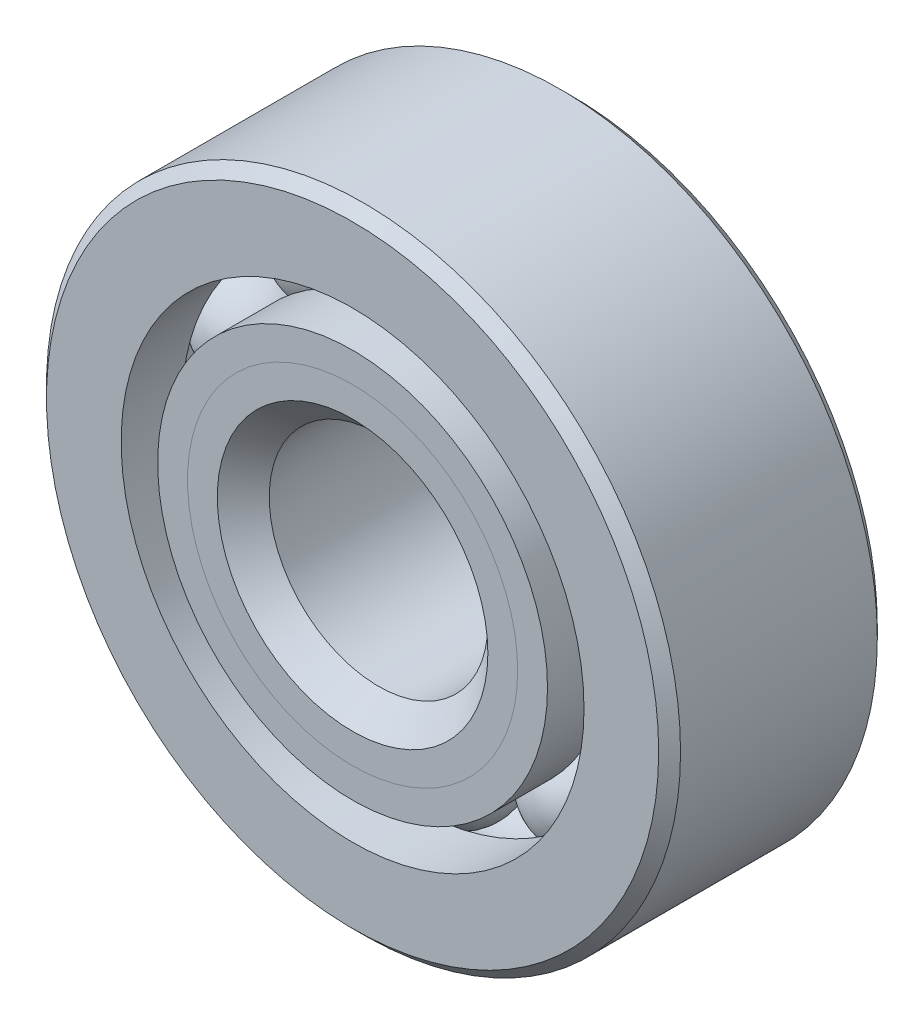
ISO-10303-21;
HEADER;
FILE_DESCRIPTION(('STEP AP214'),'2;1');
FILE_NAME('part.step','',(''),(''),'','','');
FILE_SCHEMA(('AUTOMOTIVE_DESIGN { 1 0 10303 214 1 1 1 1 }'));
ENDSEC;
DATA;
#1=APPLICATION_CONTEXT('core data for automotive mechanical design processes');
#2=APPLICATION_PROTOCOL_DEFINITION('international standard','automotive_design',2000,#1);
#3=PRODUCT_CONTEXT('',#1,'mechanical');
#4=PRODUCT('Part','Part','',(#3));
#5=PRODUCT_RELATED_PRODUCT_CATEGORY('part','',(#4));
#6=PRODUCT_DEFINITION_FORMATION('','',#4);
#7=PRODUCT_DEFINITION_CONTEXT('part definition',#1,'design');
#8=PRODUCT_DEFINITION('design','',#6,#7);
#9=PRODUCT_DEFINITION_SHAPE('','',#8);
#10=(LENGTH_UNIT() NAMED_UNIT(*) SI_UNIT(.MILLI.,.METRE.));
#11=(NAMED_UNIT(*) PLANE_ANGLE_UNIT() SI_UNIT($,.RADIAN.));
#12=(NAMED_UNIT(*) SI_UNIT($,.STERADIAN.) SOLID_ANGLE_UNIT());
#13=UNCERTAINTY_MEASURE_WITH_UNIT(LENGTH_MEASURE(1.E-05),#10,'distance_accuracy_value','');
#14=(GEOMETRIC_REPRESENTATION_CONTEXT(3) GLOBAL_UNCERTAINTY_ASSIGNED_CONTEXT((#13)) GLOBAL_UNIT_ASSIGNED_CONTEXT((#10,
#11,#12)) REPRESENTATION_CONTEXT('',''));
#15=CARTESIAN_POINT('',(0.,0.,0.));
#16=DIRECTION('',(0.,0.,1.));
#17=DIRECTION('',(1.,0.,0.));
#18=AXIS2_PLACEMENT_3D('',#15,#16,#17);
#19=CARTESIAN_POINT('',(-4.54890680406964,6.26103308302993,0.));
#20=DIRECTION('',(0.,0.,1.));
#21=DIRECTION('',(-0.587785252292462,0.809016994374955,0.));
#22=AXIS2_PLACEMENT_3D('',#19,#20,#21);
#23=SPHERICAL_SURFACE('',#22,1.88434509807669);
#24=CARTESIAN_POINT('',(-4.54890680406964,6.26103308302993,1.88434509807669));
#25=VERTEX_POINT('',#24);
#26=VERTEX_LOOP('',#25);
#27=FACE_BOUND('',#26,.T.);
#28=ADVANCED_FACE('F52',(#27),#23,.T.);
#29=CLOSED_SHELL('',(#28));
#30=MANIFOLD_SOLID_BREP('B2',#29);
#31=CARTESIAN_POINT('',(-7.36028582064043,2.39150183302995,0.));
#32=DIRECTION('',(0.,0.,1.));
#33=DIRECTION('',(-0.95105651629515,0.309016994374958,0.));
#34=AXIS2_PLACEMENT_3D('',#31,#32,#33);
#35=SPHERICAL_SURFACE('',#34,1.88434509807669);
#36=CARTESIAN_POINT('',(-7.36028582064043,2.39150183302995,1.88434509807669));
#37=VERTEX_POINT('',#36);
#38=VERTEX_LOOP('',#37);
#39=FACE_BOUND('',#38,.T.);
#40=ADVANCED_FACE('F94',(#39),#35,.T.);
#41=CLOSED_SHELL('',(#40));
#42=MANIFOLD_SOLID_BREP('B6',#41);
#43=CARTESIAN_POINT('',(-7.36028582064049,-2.3915018330298,0.));
#44=DIRECTION('',(0.,0.,1.));
#45=DIRECTION('',(-0.951056516295157,-0.309016994374938,0.));
#46=AXIS2_PLACEMENT_3D('',#43,#44,#45);
#47=SPHERICAL_SURFACE('',#46,1.88434509807669);
#48=CARTESIAN_POINT('',(-7.36028582064049,-2.3915018330298,1.88434509807669));
#49=VERTEX_POINT('',#48);
#50=VERTEX_LOOP('',#49);
#51=FACE_BOUND('',#50,.T.);
#52=ADVANCED_FACE('F136',(#51),#47,.T.);
#53=CLOSED_SHELL('',(#52));
#54=MANIFOLD_SOLID_BREP('B48',#53);
#55=CARTESIAN_POINT('',(-4.54890680406977,-6.26103308302983,0.));
#56=DIRECTION('',(0.,0.,1.));
#57=DIRECTION('',(-0.58778525229248,-0.809016994374942,0.));
#58=AXIS2_PLACEMENT_3D('',#55,#56,#57);
#59=SPHERICAL_SURFACE('',#58,1.88434509807669);
#60=CARTESIAN_POINT('',(-4.54890680406977,-6.26103308302983,1.88434509807669));
#61=VERTEX_POINT('',#60);
#62=VERTEX_LOOP('',#61);
#63=FACE_BOUND('',#62,.T.);
#64=ADVANCED_FACE('F176',(#63),#59,.T.);
#65=CLOSED_SHELL('',(#64));
#66=MANIFOLD_SOLID_BREP('B90',#65);
#67=CARTESIAN_POINT('',(0.,-7.7390625,0.));
#68=DIRECTION('',(0.,0.,1.));
#69=DIRECTION('',(0.,-1.,0.));
#70=AXIS2_PLACEMENT_3D('',#67,#68,#69);
#71=SPHERICAL_SURFACE('',#70,1.88434509807669);
#72=CARTESIAN_POINT('',(0.,-7.7390625,1.88434509807669));
#73=VERTEX_POINT('',#72);
#74=VERTEX_LOOP('',#73);
#75=FACE_BOUND('',#74,.T.);
#76=ADVANCED_FACE('F218',(#75),#71,.T.);
#77=CLOSED_SHELL('',(#76));
#78=MANIFOLD_SOLID_BREP('B132',#77);
#79=CARTESIAN_POINT('',(4.54890680406968,-6.26103308302989,0.));
#80=DIRECTION('',(0.,0.,1.));
#81=DIRECTION('',(0.587785252292469,-0.809016994374951,0.));
#82=AXIS2_PLACEMENT_3D('',#79,#80,#81);
#83=SPHERICAL_SURFACE('',#82,1.88434509807669);
#84=CARTESIAN_POINT('',(4.54890680406968,-6.26103308302989,1.88434509807669));
#85=VERTEX_POINT('',#84);
#86=VERTEX_LOOP('',#85);
#87=FACE_BOUND('',#86,.T.);
#88=ADVANCED_FACE('F260',(#87),#83,.T.);
#89=CLOSED_SHELL('',(#88));
#90=MANIFOLD_SOLID_BREP('B172',#89);
#91=CARTESIAN_POINT('',(7.36028582064045,-2.3915018330299,0.));
#92=DIRECTION('',(0.,0.,1.));
#93=DIRECTION('',(0.951056516295152,-0.309016994374952,0.));
#94=AXIS2_PLACEMENT_3D('',#91,#92,#93);
#95=SPHERICAL_SURFACE('',#94,1.88434509807669);
#96=CARTESIAN_POINT('',(7.36028582064045,-2.3915018330299,1.88434509807669));
#97=VERTEX_POINT('',#96);
#98=VERTEX_LOOP('',#97);
#99=FACE_BOUND('',#98,.T.);
#100=ADVANCED_FACE('F302',(#99),#95,.T.);
#101=CLOSED_SHELL('',(#100));
#102=MANIFOLD_SOLID_BREP('B214',#101);
#103=CARTESIAN_POINT('',(7.36028582064047,2.39150183302985,0.));
#104=DIRECTION('',(0.,0.,1.));
#105=DIRECTION('',(0.951056516295155,0.309016994374945,0.));
#106=AXIS2_PLACEMENT_3D('',#103,#104,#105);
#107=SPHERICAL_SURFACE('',#106,1.88434509807669);
#108=CARTESIAN_POINT('',(7.36028582064047,2.39150183302985,1.88434509807669));
#109=VERTEX_POINT('',#108);
#110=VERTEX_LOOP('',#109);
#111=FACE_BOUND('',#110,.T.);
#112=ADVANCED_FACE('F342',(#111),#107,.T.);
#113=CLOSED_SHELL('',(#112));
#114=MANIFOLD_SOLID_BREP('B256',#113);
#115=CARTESIAN_POINT('',(4.54890680406973,6.26103308302986,0.));
#116=DIRECTION('',(0.,0.,1.));
#117=DIRECTION('',(0.587785252292474,0.809016994374947,0.));
#118=AXIS2_PLACEMENT_3D('',#115,#116,#117);
#119=SPHERICAL_SURFACE('',#118,1.88434509807669);
#120=CARTESIAN_POINT('',(4.54890680406973,6.26103308302986,1.88434509807669));
#121=VERTEX_POINT('',#120);
#122=VERTEX_LOOP('',#121);
#123=FACE_BOUND('',#122,.T.);
#124=ADVANCED_FACE('F384',(#123),#119,.T.);
#125=CLOSED_SHELL('',(#124));
#126=MANIFOLD_SOLID_BREP('B298',#125);
#127=CARTESIAN_POINT('',(0.,7.7390625,0.));
#128=DIRECTION('',(0.,0.,1.));
#129=DIRECTION('',(0.,1.,0.));
#130=AXIS2_PLACEMENT_3D('',#127,#128,#129);
#131=SPHERICAL_SURFACE('',#130,1.88434509807669);
#132=CARTESIAN_POINT('',(0.,7.7390625,1.88434509807669));
#133=VERTEX_POINT('',#132);
#134=VERTEX_LOOP('',#133);
#135=FACE_BOUND('',#134,.T.);
#136=ADVANCED_FACE('F428',(#135),#131,.T.);
#137=CLOSED_SHELL('',(#136));
#138=MANIFOLD_SOLID_BREP('B338',#137);
#139=CARTESIAN_POINT('',(0.,5.99394205652479,3.96875));
#140=DIRECTION('',(0.,0.,-1.));
#141=DIRECTION('',(-1.,0.,0.));
#142=AXIS2_PLACEMENT_3D('',#139,#140,#141);
#143=PLANE('',#142);
#144=CARTESIAN_POINT('',(0.,0.,3.96875));
#145=DIRECTION('',(0.,0.,1.));
#146=DIRECTION('',(1.,0.,0.));
#147=AXIS2_PLACEMENT_3D('',#144,#145,#146);
#148=CIRCLE('',#147,4.91173370096166);
#149=CARTESIAN_POINT('',(4.91173370096166,0.,3.96875));
#150=VERTEX_POINT('',#149);
#151=EDGE_CURVE('E488',#150,#150,#148,.T.);
#152=ORIENTED_EDGE('',*,*,#151,.F.);
#153=EDGE_LOOP('',(#152));
#154=FACE_BOUND('',#153,.T.);
#155=CARTESIAN_POINT('',(0.,0.,3.96875));
#156=DIRECTION('',(0.,0.,1.));
#157=DIRECTION('',(1.,0.,0.));
#158=AXIS2_PLACEMENT_3D('',#155,#156,#157);
#159=CIRCLE('',#158,5.99394205652479);
#160=CARTESIAN_POINT('',(5.99394205652479,0.,3.96875));
#161=VERTEX_POINT('',#160);
#162=EDGE_CURVE('E427',#161,#161,#159,.T.);
#163=ORIENTED_EDGE('',*,*,#162,.T.);
#164=EDGE_LOOP('',(#163));
#165=FACE_BOUND('',#164,.T.);
#166=ADVANCED_FACE('F447',(#154,#165),#143,.F.);
#167=CARTESIAN_POINT('',(0.,0.,2.88654164443688));
#168=DIRECTION('',(0.,0.,1.));
#169=DIRECTION('',(1.,0.,0.));
#170=AXIS2_PLACEMENT_3D('',#167,#168,#169);
#171=CONICAL_SURFACE('',#170,4.91173370096166,0.78539816339745);
#172=ORIENTED_EDGE('',*,*,#162,.F.);
#173=EDGE_LOOP('',(#172));
#174=FACE_BOUND('',#173,.T.);
#175=CARTESIAN_POINT('',(0.,0.,2.88654164443688));
#176=DIRECTION('',(0.,0.,1.));
#177=DIRECTION('',(1.,0.,0.));
#178=AXIS2_PLACEMENT_3D('',#175,#176,#177);
#179=CIRCLE('',#178,4.91173370096166);
#180=CARTESIAN_POINT('',(4.91173370096166,0.,2.88654164443688));
#181=VERTEX_POINT('',#180);
#182=EDGE_CURVE('E454',#181,#181,#179,.T.);
#183=ORIENTED_EDGE('',*,*,#182,.T.);
#184=EDGE_LOOP('',(#183));
#185=FACE_BOUND('',#184,.T.);
#186=ADVANCED_FACE('F495',(#174,#185),#171,.T.);
#187=CARTESIAN_POINT('',(0.,0.,3.96875));
#188=DIRECTION('',(0.,0.,1.));
#189=DIRECTION('',(1.,0.,0.));
#190=AXIS2_PLACEMENT_3D('',#187,#188,#189);
#191=CYLINDRICAL_SURFACE('',#190,4.91173370096166);
#192=ORIENTED_EDGE('',*,*,#182,.F.);
#193=EDGE_LOOP('',(#192));
#194=FACE_BOUND('',#193,.T.);
#195=CARTESIAN_POINT('',(0.,0.,0.));
#196=DIRECTION('',(0.,0.,1.));
#197=DIRECTION('',(1.,0.,0.));
#198=AXIS2_PLACEMENT_3D('',#195,#196,#197);
#199=CIRCLE('',#198,4.91173370096166);
#200=CARTESIAN_POINT('',(4.91173370096166,0.,0.));
#201=VERTEX_POINT('',#200);
#202=EDGE_CURVE('E460',#201,#201,#199,.T.);
#203=ORIENTED_EDGE('',*,*,#202,.T.);
#204=EDGE_LOOP('',(#203));
#205=FACE_BOUND('',#204,.T.);
#206=ADVANCED_FACE('F499',(#194,#205),#191,.T.);
#207=CARTESIAN_POINT('',(0.,4.91173370096166,0.));
#208=DIRECTION('',(0.,0.,-1.));
#209=DIRECTION('',(-1.,0.,0.));
#210=AXIS2_PLACEMENT_3D('',#207,#208,#209);
#211=PLANE('',#210);
#212=ORIENTED_EDGE('',*,*,#202,.F.);
#213=EDGE_LOOP('',(#212));
#214=FACE_BOUND('',#213,.T.);
#215=CARTESIAN_POINT('',(0.,0.,0.));
#216=DIRECTION('',(0.,0.,1.));
#217=DIRECTION('',(1.,0.,0.));
#218=AXIS2_PLACEMENT_3D('',#215,#216,#217);
#219=CIRCLE('',#218,5.85471740192331);
#220=CARTESIAN_POINT('',(5.85471740192331,0.,0.));
#221=VERTEX_POINT('',#220);
#222=EDGE_CURVE('E466',#221,#221,#219,.T.);
#223=ORIENTED_EDGE('',*,*,#222,.T.);
#224=EDGE_LOOP('',(#223));
#225=FACE_BOUND('',#224,.T.);
#226=ADVANCED_FACE('F504',(#214,#225),#211,.F.);
#227=CARTESIAN_POINT('',(0.,0.,0.));
#228=DIRECTION('',(0.,0.,1.));
#229=DIRECTION('',(1.,0.,0.));
#230=AXIS2_PLACEMENT_3D('',#227,#228,#229);
#231=TOROIDAL_SURFACE('',#230,7.7390625,1.88434509807669);
#232=ORIENTED_EDGE('',*,*,#222,.F.);
#233=EDGE_LOOP('',(#232));
#234=FACE_BOUND('',#233,.T.);
#235=CARTESIAN_POINT('',(0.,0.,-1.76388888888889));
#236=DIRECTION('',(0.,0.,1.));
#237=DIRECTION('',(1.,0.,0.));
#238=AXIS2_PLACEMENT_3D('',#235,#236,#237);
#239=CIRCLE('',#238,7.07615041208792);
#240=CARTESIAN_POINT('',(7.07615041208792,0.,-1.76388888888889));
#241=VERTEX_POINT('',#240);
#242=EDGE_CURVE('E471',#241,#241,#239,.T.);
#243=ORIENTED_EDGE('',*,*,#242,.T.);
#244=EDGE_LOOP('',(#243));
#245=FACE_BOUND('',#244,.T.);
#246=ADVANCED_FACE('F510',(#234,#245),#231,.F.);
#247=CARTESIAN_POINT('',(0.,0.,3.96875));
#248=DIRECTION('',(0.,0.,1.));
#249=DIRECTION('',(1.,0.,0.));
#250=AXIS2_PLACEMENT_3D('',#247,#248,#249);
#251=CYLINDRICAL_SURFACE('',#250,7.07615041208792);
#252=ORIENTED_EDGE('',*,*,#242,.F.);
#253=EDGE_LOOP('',(#252));
#254=FACE_BOUND('',#253,.T.);
#255=CARTESIAN_POINT('',(0.,0.,-3.96875));
#256=DIRECTION('',(0.,0.,1.));
#257=DIRECTION('',(1.,0.,0.));
#258=AXIS2_PLACEMENT_3D('',#255,#256,#257);
#259=CIRCLE('',#258,7.07615041208791);
#260=CARTESIAN_POINT('',(7.07615041208791,0.,-3.96875));
#261=VERTEX_POINT('',#260);
#262=EDGE_CURVE('E474',#261,#261,#259,.T.);
#263=ORIENTED_EDGE('',*,*,#262,.T.);
#264=EDGE_LOOP('',(#263));
#265=FACE_BOUND('',#264,.T.);
#266=ADVANCED_FACE('F514',(#254,#265),#251,.T.);
#267=CARTESIAN_POINT('',(0.,4.365625,-3.96875));
#268=DIRECTION('',(0.,0.,1.));
#269=DIRECTION('',(1.,0.,0.));
#270=AXIS2_PLACEMENT_3D('',#267,#268,#269);
#271=PLANE('',#270);
#272=ORIENTED_EDGE('',*,*,#262,.F.);
#273=EDGE_LOOP('',(#272));
#274=FACE_BOUND('',#273,.T.);
#275=CARTESIAN_POINT('',(0.,0.,-3.96875));
#276=DIRECTION('',(0.,0.,1.));
#277=DIRECTION('',(1.,0.,0.));
#278=AXIS2_PLACEMENT_3D('',#275,#276,#277);
#279=CIRCLE('',#278,4.365625);
#280=CARTESIAN_POINT('',(4.365625,0.,-3.96875));
#281=VERTEX_POINT('',#280);
#282=EDGE_CURVE('E477',#281,#281,#279,.T.);
#283=ORIENTED_EDGE('',*,*,#282,.T.);
#284=EDGE_LOOP('',(#283));
#285=FACE_BOUND('',#284,.T.);
#286=ADVANCED_FACE('F518',(#274,#285),#271,.F.);
#287=CARTESIAN_POINT('',(0.,0.,-3.571875));
#288=DIRECTION('',(0.,0.,-1.));
#289=DIRECTION('',(-1.,0.,0.));
#290=AXIS2_PLACEMENT_3D('',#287,#288,#289);
#291=CONICAL_SURFACE('',#290,3.96875,0.785398163397445);
#292=ORIENTED_EDGE('',*,*,#282,.F.);
#293=EDGE_LOOP('',(#292));
#294=FACE_BOUND('',#293,.T.);
#295=CARTESIAN_POINT('',(0.,0.,-3.571875));
#296=DIRECTION('',(0.,0.,1.));
#297=DIRECTION('',(1.,0.,0.));
#298=AXIS2_PLACEMENT_3D('',#295,#296,#297);
#299=CIRCLE('',#298,3.96875);
#300=CARTESIAN_POINT('',(3.96875,0.,-3.571875));
#301=VERTEX_POINT('',#300);
#302=EDGE_CURVE('E481',#301,#301,#299,.T.);
#303=ORIENTED_EDGE('',*,*,#302,.T.);
#304=EDGE_LOOP('',(#303));
#305=FACE_BOUND('',#304,.T.);
#306=ADVANCED_FACE('F522',(#294,#305),#291,.F.);
#307=CARTESIAN_POINT('',(0.,0.,3.96875));
#308=DIRECTION('',(0.,0.,1.));
#309=DIRECTION('',(1.,0.,0.));
#310=AXIS2_PLACEMENT_3D('',#307,#308,#309);
#311=CYLINDRICAL_SURFACE('',#310,3.96875);
#312=ORIENTED_EDGE('',*,*,#302,.F.);
#313=EDGE_LOOP('',(#312));
#314=FACE_BOUND('',#313,.T.);
#315=CARTESIAN_POINT('',(0.,0.,3.02576629903835));
#316=DIRECTION('',(0.,0.,1.));
#317=DIRECTION('',(1.,0.,0.));
#318=AXIS2_PLACEMENT_3D('',#315,#316,#317);
#319=CIRCLE('',#318,3.96875);
#320=CARTESIAN_POINT('',(3.96875,0.,3.02576629903835));
#321=VERTEX_POINT('',#320);
#322=EDGE_CURVE('E485',#321,#321,#319,.T.);
#323=ORIENTED_EDGE('',*,*,#322,.T.);
#324=EDGE_LOOP('',(#323));
#325=FACE_BOUND('',#324,.T.);
#326=ADVANCED_FACE('F526',(#314,#325),#311,.F.);
#327=CARTESIAN_POINT('',(0.,0.,3.96875));
#328=DIRECTION('',(0.,0.,1.));
#329=DIRECTION('',(1.,0.,0.));
#330=AXIS2_PLACEMENT_3D('',#327,#328,#329);
#331=CONICAL_SURFACE('',#330,4.91173370096166,0.78539816339745);
#332=ORIENTED_EDGE('',*,*,#322,.F.);
#333=EDGE_LOOP('',(#332));
#334=FACE_BOUND('',#333,.T.);
#335=ORIENTED_EDGE('',*,*,#151,.T.);
#336=EDGE_LOOP('',(#335));
#337=FACE_BOUND('',#336,.T.);
#338=ADVANCED_FACE('F492',(#334,#337),#331,.F.);
#339=CLOSED_SHELL('',(#166,#186,#206,#226,#246,#266,#286,#306,#326,#338));
#340=MANIFOLD_SOLID_BREP('B380',#339);
#341=CARTESIAN_POINT('',(0.,7.07615041208792,3.96875));
#342=DIRECTION('',(0.,0.,-1.));
#343=DIRECTION('',(-1.,0.,0.));
#344=AXIS2_PLACEMENT_3D('',#341,#342,#343);
#345=PLANE('',#344);
#346=CARTESIAN_POINT('',(0.,0.,3.96875));
#347=DIRECTION('',(0.,0.,1.));
#348=DIRECTION('',(1.,0.,0.));
#349=AXIS2_PLACEMENT_3D('',#346,#347,#348);
#350=CIRCLE('',#349,5.99394205652479);
#351=CARTESIAN_POINT('',(5.99394205652479,0.,3.96875));
#352=VERTEX_POINT('',#351);
#353=EDGE_CURVE('E446',#352,#352,#350,.T.);
#354=ORIENTED_EDGE('',*,*,#353,.F.);
#355=EDGE_LOOP('',(#354));
#356=FACE_BOUND('',#355,.T.);
#357=CARTESIAN_POINT('',(0.,0.,3.96875));
#358=DIRECTION('',(0.,0.,1.));
#359=DIRECTION('',(1.,0.,0.));
#360=AXIS2_PLACEMENT_3D('',#357,#358,#359);
#361=CIRCLE('',#360,7.07615041208792);
#362=CARTESIAN_POINT('',(7.07615041208792,0.,3.96875));
#363=VERTEX_POINT('',#362);
#364=EDGE_CURVE('E618',#363,#363,#361,.T.);
#365=ORIENTED_EDGE('',*,*,#364,.T.);
#366=EDGE_LOOP('',(#365));
#367=FACE_BOUND('',#366,.T.);
#368=ADVANCED_FACE('F593',(#356,#367),#345,.F.);
#369=CARTESIAN_POINT('',(0.,0.,3.96875));
#370=DIRECTION('',(0.,0.,1.));
#371=DIRECTION('',(1.,0.,0.));
#372=AXIS2_PLACEMENT_3D('',#369,#370,#371);
#373=CONICAL_SURFACE('',#372,5.99394205652479,0.78539816339745);
#374=CARTESIAN_POINT('',(0.,0.,2.88654164443688));
#375=DIRECTION('',(0.,0.,1.));
#376=DIRECTION('',(1.,0.,0.));
#377=AXIS2_PLACEMENT_3D('',#374,#375,#376);
#378=CIRCLE('',#377,4.91173370096166);
#379=CARTESIAN_POINT('',(4.91173370096166,0.,2.88654164443688));
#380=VERTEX_POINT('',#379);
#381=EDGE_CURVE('E600',#380,#380,#378,.T.);
#382=ORIENTED_EDGE('',*,*,#381,.F.);
#383=EDGE_LOOP('',(#382));
#384=FACE_BOUND('',#383,.T.);
#385=ORIENTED_EDGE('',*,*,#353,.T.);
#386=EDGE_LOOP('',(#385));
#387=FACE_BOUND('',#386,.T.);
#388=ADVANCED_FACE('F643',(#384,#387),#373,.F.);
#389=CARTESIAN_POINT('',(0.,0.,3.96875));
#390=DIRECTION('',(0.,0.,1.));
#391=DIRECTION('',(1.,0.,0.));
#392=AXIS2_PLACEMENT_3D('',#389,#390,#391);
#393=CYLINDRICAL_SURFACE('',#392,4.91173370096166);
#394=CARTESIAN_POINT('',(0.,0.,0.));
#395=DIRECTION('',(0.,0.,1.));
#396=DIRECTION('',(1.,0.,0.));
#397=AXIS2_PLACEMENT_3D('',#394,#395,#396);
#398=CIRCLE('',#397,4.91173370096166);
#399=CARTESIAN_POINT('',(4.91173370096166,0.,0.));
#400=VERTEX_POINT('',#399);
#401=EDGE_CURVE('E605',#400,#400,#398,.T.);
#402=ORIENTED_EDGE('',*,*,#401,.F.);
#403=EDGE_LOOP('',(#402));
#404=FACE_BOUND('',#403,.T.);
#405=ORIENTED_EDGE('',*,*,#381,.T.);
#406=EDGE_LOOP('',(#405));
#407=FACE_BOUND('',#406,.T.);
#408=ADVANCED_FACE('F638',(#404,#407),#393,.F.);
#409=CARTESIAN_POINT('',(0.,4.91173370096166,0.));
#410=DIRECTION('',(0.,0.,1.));
#411=DIRECTION('',(1.,0.,0.));
#412=AXIS2_PLACEMENT_3D('',#409,#410,#411);
#413=PLANE('',#412);
#414=CARTESIAN_POINT('',(0.,0.,0.));
#415=DIRECTION('',(0.,0.,1.));
#416=DIRECTION('',(1.,0.,0.));
#417=AXIS2_PLACEMENT_3D('',#414,#415,#416);
#418=CIRCLE('',#417,5.85471740192331);
#419=CARTESIAN_POINT('',(5.85471740192331,0.,0.));
#420=VERTEX_POINT('',#419);
#421=EDGE_CURVE('E610',#420,#420,#418,.T.);
#422=ORIENTED_EDGE('',*,*,#421,.F.);
#423=EDGE_LOOP('',(#422));
#424=FACE_BOUND('',#423,.T.);
#425=ORIENTED_EDGE('',*,*,#401,.T.);
#426=EDGE_LOOP('',(#425));
#427=FACE_BOUND('',#426,.T.);
#428=ADVANCED_FACE('F632',(#424,#427),#413,.F.);
#429=CARTESIAN_POINT('',(0.,0.,0.));
#430=DIRECTION('',(0.,0.,1.));
#431=DIRECTION('',(1.,0.,0.));
#432=AXIS2_PLACEMENT_3D('',#429,#430,#431);
#433=TOROIDAL_SURFACE('',#432,7.7390625,1.88434509807669);
#434=CARTESIAN_POINT('',(0.,0.,1.76388888888889));
#435=DIRECTION('',(0.,0.,1.));
#436=DIRECTION('',(1.,0.,0.));
#437=AXIS2_PLACEMENT_3D('',#434,#435,#436);
#438=CIRCLE('',#437,7.07615041208792);
#439=CARTESIAN_POINT('',(7.07615041208792,0.,1.76388888888889));
#440=VERTEX_POINT('',#439);
#441=EDGE_CURVE('E615',#440,#440,#438,.T.);
#442=ORIENTED_EDGE('',*,*,#441,.F.);
#443=EDGE_LOOP('',(#442));
#444=FACE_BOUND('',#443,.T.);
#445=ORIENTED_EDGE('',*,*,#421,.T.);
#446=EDGE_LOOP('',(#445));
#447=FACE_BOUND('',#446,.T.);
#448=ADVANCED_FACE('F626',(#444,#447),#433,.F.);
#449=CARTESIAN_POINT('',(0.,0.,3.96875));
#450=DIRECTION('',(0.,0.,1.));
#451=DIRECTION('',(1.,0.,0.));
#452=AXIS2_PLACEMENT_3D('',#449,#450,#451);
#453=CYLINDRICAL_SURFACE('',#452,7.07615041208792);
#454=ORIENTED_EDGE('',*,*,#364,.F.);
#455=EDGE_LOOP('',(#454));
#456=FACE_BOUND('',#455,.T.);
#457=ORIENTED_EDGE('',*,*,#441,.T.);
#458=EDGE_LOOP('',(#457));
#459=FACE_BOUND('',#458,.T.);
#460=ADVANCED_FACE('F623',(#456,#459),#453,.T.);
#461=CLOSED_SHELL('',(#368,#388,#408,#428,#448,#460));
#462=MANIFOLD_SOLID_BREP('B422',#461);
#463=CARTESIAN_POINT('',(0.,0.,3.571875));
#464=DIRECTION('',(0.,0.,-1.));
#465=DIRECTION('',(-1.,0.,0.));
#466=AXIS2_PLACEMENT_3D('',#463,#464,#465);
#467=CONICAL_SURFACE('',#466,11.509375,0.785398163397449);
#468=CARTESIAN_POINT('',(0.,0.,3.96875));
#469=DIRECTION('',(0.,0.,1.));
#470=DIRECTION('',(1.,0.,0.));
#471=AXIS2_PLACEMENT_3D('',#468,#469,#470);
#472=CIRCLE('',#471,11.1125);
#473=CARTESIAN_POINT('',(11.1125,0.,3.96875));
#474=VERTEX_POINT('',#473);
#475=EDGE_CURVE('E711',#474,#474,#472,.T.);
#476=ORIENTED_EDGE('',*,*,#475,.F.);
#477=EDGE_LOOP('',(#476));
#478=FACE_BOUND('',#477,.T.);
#479=CARTESIAN_POINT('',(0.,0.,3.571875));
#480=DIRECTION('',(0.,0.,1.));
#481=DIRECTION('',(1.,0.,0.));
#482=AXIS2_PLACEMENT_3D('',#479,#480,#481);
#483=CIRCLE('',#482,11.509375);
#484=CARTESIAN_POINT('',(11.509375,0.,3.571875));
#485=VERTEX_POINT('',#484);
#486=EDGE_CURVE('E592',#485,#485,#483,.T.);
#487=ORIENTED_EDGE('',*,*,#486,.T.);
#488=EDGE_LOOP('',(#487));
#489=FACE_BOUND('',#488,.T.);
#490=ADVANCED_FACE('F676',(#478,#489),#467,.T.);
#491=CARTESIAN_POINT('',(0.,0.,3.96875));
#492=DIRECTION('',(0.,0.,1.));
#493=DIRECTION('',(1.,0.,0.));
#494=AXIS2_PLACEMENT_3D('',#491,#492,#493);
#495=CYLINDRICAL_SURFACE('',#494,11.509375);
#496=ORIENTED_EDGE('',*,*,#486,.F.);
#497=EDGE_LOOP('',(#496));
#498=FACE_BOUND('',#497,.T.);
#499=CARTESIAN_POINT('',(0.,0.,-3.571875));
#500=DIRECTION('',(0.,0.,1.));
#501=DIRECTION('',(1.,0.,0.));
#502=AXIS2_PLACEMENT_3D('',#499,#500,#501);
#503=CIRCLE('',#502,11.509375);
#504=CARTESIAN_POINT('',(11.509375,0.,-3.571875));
#505=VERTEX_POINT('',#504);
#506=EDGE_CURVE('E683',#505,#505,#503,.T.);
#507=ORIENTED_EDGE('',*,*,#506,.T.);
#508=EDGE_LOOP('',(#507));
#509=FACE_BOUND('',#508,.T.);
#510=ADVANCED_FACE('F719',(#498,#509),#495,.T.);
#511=CARTESIAN_POINT('',(0.,0.,-3.96875));
#512=DIRECTION('',(0.,0.,1.));
#513=DIRECTION('',(1.,0.,0.));
#514=AXIS2_PLACEMENT_3D('',#511,#512,#513);
#515=CONICAL_SURFACE('',#514,11.1125,0.78539816339745);
#516=ORIENTED_EDGE('',*,*,#506,.F.);
#517=EDGE_LOOP('',(#516));
#518=FACE_BOUND('',#517,.T.);
#519=CARTESIAN_POINT('',(0.,0.,-3.96875));
#520=DIRECTION('',(0.,0.,1.));
#521=DIRECTION('',(1.,0.,0.));
#522=AXIS2_PLACEMENT_3D('',#519,#520,#521);
#523=CIRCLE('',#522,11.1125);
#524=CARTESIAN_POINT('',(11.1125,0.,-3.96875));
#525=VERTEX_POINT('',#524);
#526=EDGE_CURVE('E688',#525,#525,#523,.T.);
#527=ORIENTED_EDGE('',*,*,#526,.T.);
#528=EDGE_LOOP('',(#527));
#529=FACE_BOUND('',#528,.T.);
#530=ADVANCED_FACE('F723',(#518,#529),#515,.T.);
#531=CARTESIAN_POINT('',(0.,11.1125,-3.96875));
#532=DIRECTION('',(0.,0.,1.));
#533=DIRECTION('',(1.,0.,0.));
#534=AXIS2_PLACEMENT_3D('',#531,#532,#533);
#535=PLANE('',#534);
#536=ORIENTED_EDGE('',*,*,#526,.F.);
#537=EDGE_LOOP('',(#536));
#538=FACE_BOUND('',#537,.T.);
#539=CARTESIAN_POINT('',(0.,0.,-3.96875));
#540=DIRECTION('',(0.,0.,1.));
#541=DIRECTION('',(1.,0.,0.));
#542=AXIS2_PLACEMENT_3D('',#539,#540,#541);
#543=CIRCLE('',#542,8.40197458791209);
#544=CARTESIAN_POINT('',(8.40197458791209,0.,-3.96875));
#545=VERTEX_POINT('',#544);
#546=EDGE_CURVE('E693',#545,#545,#543,.T.);
#547=ORIENTED_EDGE('',*,*,#546,.T.);
#548=EDGE_LOOP('',(#547));
#549=FACE_BOUND('',#548,.T.);
#550=ADVANCED_FACE('F728',(#538,#549),#535,.F.);
#551=CARTESIAN_POINT('',(0.,0.,3.96875));
#552=DIRECTION('',(0.,0.,1.));
#553=DIRECTION('',(1.,0.,0.));
#554=AXIS2_PLACEMENT_3D('',#551,#552,#553);
#555=CYLINDRICAL_SURFACE('',#554,8.40197458791209);
#556=ORIENTED_EDGE('',*,*,#546,.F.);
#557=EDGE_LOOP('',(#556));
#558=FACE_BOUND('',#557,.T.);
#559=CARTESIAN_POINT('',(0.,0.,-1.76388888888889));
#560=DIRECTION('',(0.,0.,1.));
#561=DIRECTION('',(1.,0.,0.));
#562=AXIS2_PLACEMENT_3D('',#559,#560,#561);
#563=CIRCLE('',#562,8.40197458791209);
#564=CARTESIAN_POINT('',(8.40197458791209,0.,-1.76388888888889));
#565=VERTEX_POINT('',#564);
#566=EDGE_CURVE('E699',#565,#565,#563,.T.);
#567=ORIENTED_EDGE('',*,*,#566,.T.);
#568=EDGE_LOOP('',(#567));
#569=FACE_BOUND('',#568,.T.);
#570=ADVANCED_FACE('F734',(#558,#569),#555,.F.);
#571=CARTESIAN_POINT('',(0.,0.,0.));
#572=DIRECTION('',(0.,0.,1.));
#573=DIRECTION('',(1.,0.,0.));
#574=AXIS2_PLACEMENT_3D('',#571,#572,#573);
#575=TOROIDAL_SURFACE('',#574,7.7390625,1.88434509807669);
#576=ORIENTED_EDGE('',*,*,#566,.F.);
#577=EDGE_LOOP('',(#576));
#578=FACE_BOUND('',#577,.T.);
#579=CARTESIAN_POINT('',(0.,0.,1.76388888888889));
#580=DIRECTION('',(0.,0.,1.));
#581=DIRECTION('',(1.,0.,0.));
#582=AXIS2_PLACEMENT_3D('',#579,#580,#581);
#583=CIRCLE('',#582,8.40197458791209);
#584=CARTESIAN_POINT('',(8.40197458791209,0.,1.76388888888889));
#585=VERTEX_POINT('',#584);
#586=EDGE_CURVE('E703',#585,#585,#583,.T.);
#587=ORIENTED_EDGE('',*,*,#586,.T.);
#588=EDGE_LOOP('',(#587));
#589=FACE_BOUND('',#588,.T.);
#590=ADVANCED_FACE('F738',(#578,#589),#575,.F.);
#591=CARTESIAN_POINT('',(0.,0.,3.96875));
#592=DIRECTION('',(0.,0.,1.));
#593=DIRECTION('',(1.,0.,0.));
#594=AXIS2_PLACEMENT_3D('',#591,#592,#593);
#595=CYLINDRICAL_SURFACE('',#594,8.40197458791209);
#596=ORIENTED_EDGE('',*,*,#586,.F.);
#597=EDGE_LOOP('',(#596));
#598=FACE_BOUND('',#597,.T.);
#599=CARTESIAN_POINT('',(0.,0.,3.96875));
#600=DIRECTION('',(0.,0.,1.));
#601=DIRECTION('',(1.,0.,0.));
#602=AXIS2_PLACEMENT_3D('',#599,#600,#601);
#603=CIRCLE('',#602,8.40197458791209);
#604=CARTESIAN_POINT('',(8.40197458791209,0.,3.96875));
#605=VERTEX_POINT('',#604);
#606=EDGE_CURVE('E707',#605,#605,#603,.T.);
#607=ORIENTED_EDGE('',*,*,#606,.T.);
#608=EDGE_LOOP('',(#607));
#609=FACE_BOUND('',#608,.T.);
#610=ADVANCED_FACE('F742',(#598,#609),#595,.F.);
#611=CARTESIAN_POINT('',(0.,11.1125,3.96875));
#612=DIRECTION('',(0.,0.,-1.));
#613=DIRECTION('',(-1.,0.,0.));
#614=AXIS2_PLACEMENT_3D('',#611,#612,#613);
#615=PLANE('',#614);
#616=ORIENTED_EDGE('',*,*,#606,.F.);
#617=EDGE_LOOP('',(#616));
#618=FACE_BOUND('',#617,.T.);
#619=ORIENTED_EDGE('',*,*,#475,.T.);
#620=EDGE_LOOP('',(#619));
#621=FACE_BOUND('',#620,.T.);
#622=ADVANCED_FACE('F716',(#618,#621),#615,.F.);
#623=CLOSED_SHELL('',(#490,#510,#530,#550,#570,#590,#610,#622));
#624=MANIFOLD_SOLID_BREP('B441',#623);
#625=ADVANCED_BREP_SHAPE_REPRESENTATION('',(#18,#30,#42,#54,#66,#78,#90,#102,#114,#126,#138,
#340,#462,#624),#14);
#626=SHAPE_DEFINITION_REPRESENTATION(#9,#625);
ENDSEC;
END-ISO-10303-21;
